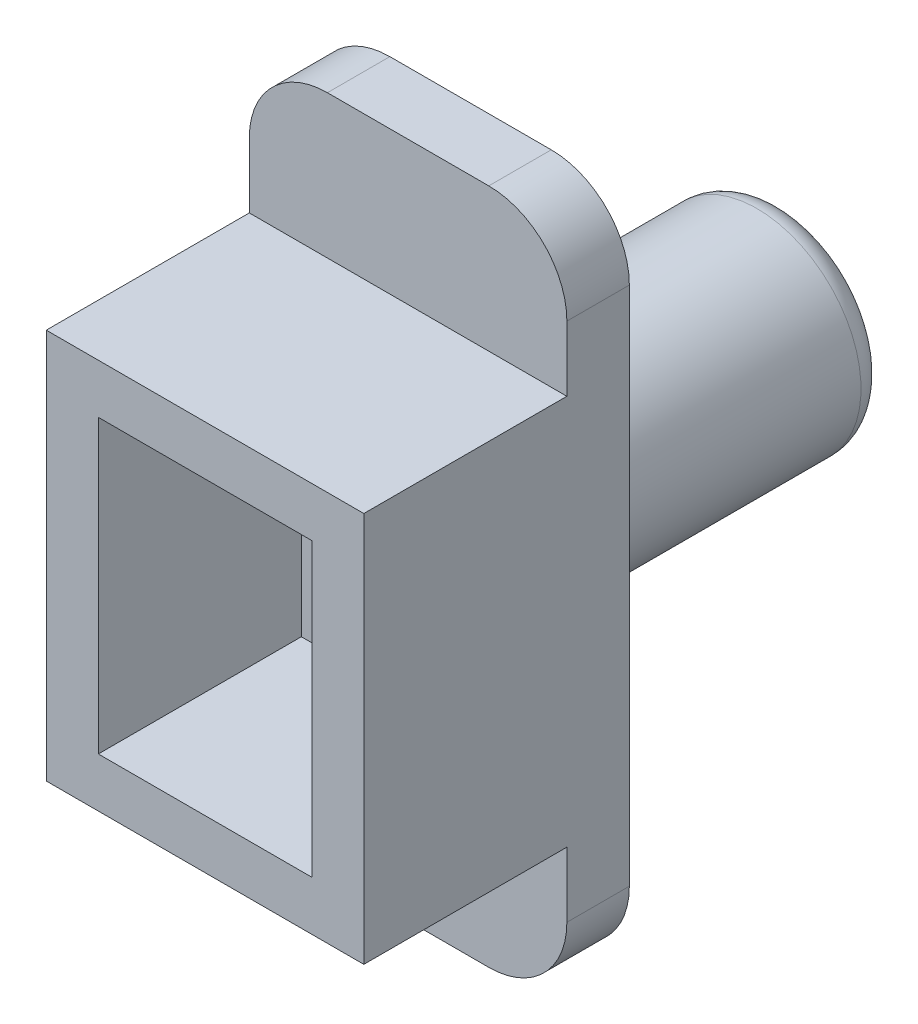
ISO-10303-21;
HEADER;
FILE_DESCRIPTION(('STEP AP214'),'2;1');
FILE_NAME('part.step','',(''),(''),'','','');
FILE_SCHEMA(('AUTOMOTIVE_DESIGN { 1 0 10303 214 1 1 1 1 }'));
ENDSEC;
DATA;
#1=APPLICATION_CONTEXT('core data for automotive mechanical design processes');
#2=APPLICATION_PROTOCOL_DEFINITION('international standard','automotive_design',2000,#1);
#3=PRODUCT_CONTEXT('',#1,'mechanical');
#4=PRODUCT('Part','Part','',(#3));
#5=PRODUCT_RELATED_PRODUCT_CATEGORY('part','',(#4));
#6=PRODUCT_DEFINITION_FORMATION('','',#4);
#7=PRODUCT_DEFINITION_CONTEXT('part definition',#1,'design');
#8=PRODUCT_DEFINITION('design','',#6,#7);
#9=PRODUCT_DEFINITION_SHAPE('','',#8);
#10=(LENGTH_UNIT() NAMED_UNIT(*) SI_UNIT(.MILLI.,.METRE.));
#11=(NAMED_UNIT(*) PLANE_ANGLE_UNIT() SI_UNIT($,.RADIAN.));
#12=(NAMED_UNIT(*) SI_UNIT($,.STERADIAN.) SOLID_ANGLE_UNIT());
#13=UNCERTAINTY_MEASURE_WITH_UNIT(LENGTH_MEASURE(1.E-05),#10,'distance_accuracy_value','');
#14=(GEOMETRIC_REPRESENTATION_CONTEXT(3) GLOBAL_UNCERTAINTY_ASSIGNED_CONTEXT((#13)) GLOBAL_UNIT_ASSIGNED_CONTEXT((#10,
#11,#12)) REPRESENTATION_CONTEXT('',''));
#15=CARTESIAN_POINT('',(0.,0.,0.));
#16=DIRECTION('',(0.,0.,1.));
#17=DIRECTION('',(1.,0.,0.));
#18=AXIS2_PLACEMENT_3D('',#15,#16,#17);
#19=CARTESIAN_POINT('',(0.,0.,-4.8));
#20=DIRECTION('',(0.,0.,1.));
#21=DIRECTION('',(1.,0.,0.));
#22=AXIS2_PLACEMENT_3D('',#19,#20,#21);
#23=PLANE('',#22);
#24=CARTESIAN_POINT('',(0.,0.,-4.8));
#25=DIRECTION('',(0.,0.,1.));
#26=DIRECTION('',(1.,0.,0.));
#27=AXIS2_PLACEMENT_3D('',#24,#25,#26);
#28=CIRCLE('',#27,0.75);
#29=CARTESIAN_POINT('',(0.75,0.,-4.8));
#30=VERTEX_POINT('',#29);
#31=EDGE_CURVE('E351',#30,#30,#28,.T.);
#32=ORIENTED_EDGE('',*,*,#31,.T.);
#33=EDGE_LOOP('',(#32));
#34=FACE_BOUND('',#33,.T.);
#35=ADVANCED_FACE('F17',(#34),#23,.T.);
#36=CARTESIAN_POINT('',(0.,0.,1.2));
#37=DIRECTION('',(0.,0.,1.));
#38=DIRECTION('',(1.,0.,0.));
#39=AXIS2_PLACEMENT_3D('',#36,#37,#38);
#40=CYLINDRICAL_SURFACE('',#39,0.75);
#41=ORIENTED_EDGE('',*,*,#31,.F.);
#42=EDGE_LOOP('',(#41));
#43=FACE_BOUND('',#42,.T.);
#44=CARTESIAN_POINT('',(0.,0.,1.2));
#45=DIRECTION('',(0.,0.,1.));
#46=DIRECTION('',(1.,0.,0.));
#47=AXIS2_PLACEMENT_3D('',#44,#45,#46);
#48=CIRCLE('',#47,0.75);
#49=CARTESIAN_POINT('',(0.75,0.,1.2));
#50=VERTEX_POINT('',#49);
#51=EDGE_CURVE('E347',#50,#50,#48,.T.);
#52=ORIENTED_EDGE('',*,*,#51,.T.);
#53=EDGE_LOOP('',(#52));
#54=FACE_BOUND('',#53,.T.);
#55=ADVANCED_FACE('F213',(#43,#54),#40,.F.);
#56=CARTESIAN_POINT('',(0.,0.,1.2));
#57=DIRECTION('',(0.,0.,-1.));
#58=DIRECTION('',(-1.,0.,0.));
#59=AXIS2_PLACEMENT_3D('',#56,#57,#58);
#60=PLANE('',#59);
#61=ORIENTED_EDGE('',*,*,#51,.F.);
#62=EDGE_LOOP('',(#61));
#63=FACE_BOUND('',#62,.T.);
#64=DIRECTION('',(0.,1.,0.));
#65=VECTOR('',#64,1.);
#66=CARTESIAN_POINT('',(-2.05,2.8,1.2));
#67=LINE('',#66,#65);
#68=CARTESIAN_POINT('',(-2.05,2.8,1.2));
#69=VERTEX_POINT('',#68);
#70=CARTESIAN_POINT('',(-2.05,-2.8,1.2));
#71=VERTEX_POINT('',#70);
#72=EDGE_CURVE('E440',#69,#71,#67,.F.);
#73=ORIENTED_EDGE('',*,*,#72,.T.);
#74=DIRECTION('',(1.,0.,0.));
#75=VECTOR('',#74,1.);
#76=CARTESIAN_POINT('',(-2.05,-2.8,1.2));
#77=LINE('',#76,#75);
#78=CARTESIAN_POINT('',(2.05,-2.8,1.2));
#79=VERTEX_POINT('',#78);
#80=EDGE_CURVE('E445',#71,#79,#77,.T.);
#81=ORIENTED_EDGE('',*,*,#80,.T.);
#82=DIRECTION('',(0.,1.,0.));
#83=VECTOR('',#82,1.);
#84=CARTESIAN_POINT('',(2.05,-2.8,1.2));
#85=LINE('',#84,#83);
#86=CARTESIAN_POINT('',(2.05,2.8,1.2));
#87=VERTEX_POINT('',#86);
#88=EDGE_CURVE('E355',#79,#87,#85,.T.);
#89=ORIENTED_EDGE('',*,*,#88,.T.);
#90=DIRECTION('',(1.,0.,0.));
#91=VECTOR('',#90,1.);
#92=CARTESIAN_POINT('',(2.05,2.8,1.2));
#93=LINE('',#92,#91);
#94=EDGE_CURVE('E350',#87,#69,#93,.F.);
#95=ORIENTED_EDGE('',*,*,#94,.T.);
#96=EDGE_LOOP('',(#73,#81,#89,#95));
#97=FACE_BOUND('',#96,.T.);
#98=ADVANCED_FACE('F210',(#63,#97),#60,.F.);
#99=CARTESIAN_POINT('',(2.05,2.8,5.1));
#100=DIRECTION('',(0.,1.,0.));
#101=DIRECTION('',(0.,0.,1.));
#102=AXIS2_PLACEMENT_3D('',#99,#100,#101);
#103=PLANE('',#102);
#104=DIRECTION('',(1.,0.,0.));
#105=VECTOR('',#104,1.);
#106=CARTESIAN_POINT('',(0.,2.8,5.1));
#107=LINE('',#106,#105);
#108=CARTESIAN_POINT('',(-2.05,2.8,5.1));
#109=VERTEX_POINT('',#108);
#110=CARTESIAN_POINT('',(2.05,2.8,5.1));
#111=VERTEX_POINT('',#110);
#112=EDGE_CURVE('E306',#109,#111,#107,.T.);
#113=ORIENTED_EDGE('',*,*,#112,.F.);
#114=DIRECTION('',(0.,0.,1.));
#115=VECTOR('',#114,1.);
#116=CARTESIAN_POINT('',(-2.05,2.8,5.1));
#117=LINE('',#116,#115);
#118=EDGE_CURVE('E313',#109,#69,#117,.F.);
#119=ORIENTED_EDGE('',*,*,#118,.T.);
#120=ORIENTED_EDGE('',*,*,#94,.F.);
#121=DIRECTION('',(0.,0.,-1.));
#122=VECTOR('',#121,1.);
#123=CARTESIAN_POINT('',(2.05,2.8,5.1));
#124=LINE('',#123,#122);
#125=EDGE_CURVE('E361',#87,#111,#124,.F.);
#126=ORIENTED_EDGE('',*,*,#125,.T.);
#127=EDGE_LOOP('',(#113,#119,#120,#126));
#128=FACE_BOUND('',#127,.T.);
#129=ADVANCED_FACE('F206',(#128),#103,.F.);
#130=CARTESIAN_POINT('',(2.05,-2.8,5.1));
#131=DIRECTION('',(1.,0.,0.));
#132=DIRECTION('',(0.,0.,-1.));
#133=AXIS2_PLACEMENT_3D('',#130,#131,#132);
#134=PLANE('',#133);
#135=DIRECTION('',(0.,1.,0.));
#136=VECTOR('',#135,1.);
#137=CARTESIAN_POINT('',(2.05,0.,5.1));
#138=LINE('',#137,#136);
#139=CARTESIAN_POINT('',(2.05,-2.8,5.1));
#140=VERTEX_POINT('',#139);
#141=EDGE_CURVE('E304',#111,#140,#138,.F.);
#142=ORIENTED_EDGE('',*,*,#141,.F.);
#143=ORIENTED_EDGE('',*,*,#125,.F.);
#144=ORIENTED_EDGE('',*,*,#88,.F.);
#145=DIRECTION('',(0.,0.,-1.));
#146=VECTOR('',#145,1.);
#147=CARTESIAN_POINT('',(2.05,-2.8,5.1));
#148=LINE('',#147,#146);
#149=EDGE_CURVE('E442',#79,#140,#148,.F.);
#150=ORIENTED_EDGE('',*,*,#149,.T.);
#151=EDGE_LOOP('',(#142,#143,#144,#150));
#152=FACE_BOUND('',#151,.T.);
#153=ADVANCED_FACE('F202',(#152),#134,.F.);
#154=CARTESIAN_POINT('',(-2.05,-2.8,5.1));
#155=DIRECTION('',(0.,-1.,0.));
#156=DIRECTION('',(0.,0.,-1.));
#157=AXIS2_PLACEMENT_3D('',#154,#155,#156);
#158=PLANE('',#157);
#159=DIRECTION('',(1.,0.,0.));
#160=VECTOR('',#159,1.);
#161=CARTESIAN_POINT('',(0.,-2.8,5.1));
#162=LINE('',#161,#160);
#163=CARTESIAN_POINT('',(-2.05,-2.8,5.1));
#164=VERTEX_POINT('',#163);
#165=EDGE_CURVE('E302',#140,#164,#162,.F.);
#166=ORIENTED_EDGE('',*,*,#165,.F.);
#167=ORIENTED_EDGE('',*,*,#149,.F.);
#168=ORIENTED_EDGE('',*,*,#80,.F.);
#169=DIRECTION('',(0.,0.,1.));
#170=VECTOR('',#169,1.);
#171=CARTESIAN_POINT('',(-2.05,-2.8,5.1));
#172=LINE('',#171,#170);
#173=EDGE_CURVE('E437',#71,#164,#172,.T.);
#174=ORIENTED_EDGE('',*,*,#173,.T.);
#175=EDGE_LOOP('',(#166,#167,#168,#174));
#176=FACE_BOUND('',#175,.T.);
#177=ADVANCED_FACE('F198',(#176),#158,.F.);
#178=CARTESIAN_POINT('',(-2.05,2.8,5.1));
#179=DIRECTION('',(-1.,0.,0.));
#180=DIRECTION('',(0.,0.,1.));
#181=AXIS2_PLACEMENT_3D('',#178,#179,#180);
#182=PLANE('',#181);
#183=DIRECTION('',(0.,1.,0.));
#184=VECTOR('',#183,1.);
#185=CARTESIAN_POINT('',(-2.05,0.,5.1));
#186=LINE('',#185,#184);
#187=EDGE_CURVE('E299',#164,#109,#186,.T.);
#188=ORIENTED_EDGE('',*,*,#187,.F.);
#189=ORIENTED_EDGE('',*,*,#173,.F.);
#190=ORIENTED_EDGE('',*,*,#72,.F.);
#191=ORIENTED_EDGE('',*,*,#118,.F.);
#192=EDGE_LOOP('',(#188,#189,#190,#191));
#193=FACE_BOUND('',#192,.T.);
#194=ADVANCED_FACE('F193',(#193),#182,.F.);
#195=CARTESIAN_POINT('',(0.,0.,-6.));
#196=DIRECTION('',(0.,0.,-1.));
#197=DIRECTION('',(-1.,0.,0.));
#198=AXIS2_PLACEMENT_3D('',#195,#196,#197);
#199=PLANE('',#198);
#200=DIRECTION('',(-0.00697686083401635,0.999975661410268,0.));
#201=VECTOR('',#200,1.);
#202=CARTESIAN_POINT('',(1.499999949272,0.,-6.));
#203=LINE('',#202,#201);
#204=CARTESIAN_POINT('',(1.499999863604,0.,-5.99999999999995));
#205=VERTEX_POINT('',#204);
#206=CARTESIAN_POINT('',(1.49985369664931,0.0209300692633115,-5.99999999999994));
#207=VERTEX_POINT('',#206);
#208=EDGE_CURVE('E173',#205,#207,#203,.T.);
#209=ORIENTED_EDGE('',*,*,#208,.F.);
#210=CARTESIAN_POINT('',(0.,0.,-5.99999999999975));
#211=DIRECTION('',(0.,0.,1.));
#212=DIRECTION('',(-0.999902646823717,-0.0139533822038046,0.));
#213=AXIS2_PLACEMENT_3D('',#210,#211,#212);
#214=CIRCLE('',#213,1.49999949556802);
#215=CARTESIAN_POINT('',(-1.49985369268261,-0.020930069432528,-5.99999999999994));
#216=VERTEX_POINT('',#215);
#217=EDGE_CURVE('E164',#216,#205,#214,.T.);
#218=ORIENTED_EDGE('',*,*,#217,.F.);
#219=DIRECTION('',(0.0069768609088604,-0.999975661409746,0.));
#220=VECTOR('',#219,1.);
#221=CARTESIAN_POINT('',(-1.499999949272,0.,-6.));
#222=LINE('',#221,#220);
#223=CARTESIAN_POINT('',(-1.49999982061198,0.,-5.99999999999994));
#224=VERTEX_POINT('',#223);
#225=EDGE_CURVE('E160',#224,#216,#222,.T.);
#226=ORIENTED_EDGE('',*,*,#225,.F.);
#227=CARTESIAN_POINT('',(0.,0.,-5.99999999999975));
#228=DIRECTION('',(0.,0.,1.));
#229=DIRECTION('',(0.999902646825806,0.013953382054121,0.));
#230=AXIS2_PLACEMENT_3D('',#227,#228,#229);
#231=CIRCLE('',#230,1.49999950349592);
#232=EDGE_CURVE('E167',#207,#224,#231,.T.);
#233=ORIENTED_EDGE('',*,*,#232,.F.);
#234=EDGE_LOOP('',(#209,#218,#226,#233));
#235=FACE_BOUND('',#234,.T.);
#236=ADVANCED_FACE('F172',(#235),#199,.T.);
#237=CARTESIAN_POINT('',(0.,0.,1.2));
#238=DIRECTION('',(0.,0.,-1.));
#239=DIRECTION('',(-1.,0.,0.));
#240=AXIS2_PLACEMENT_3D('',#237,#238,#239);
#241=PLANE('',#240);
#242=DIRECTION('',(1.,0.,0.));
#243=VECTOR('',#242,1.);
#244=CARTESIAN_POINT('',(3.05,3.75,1.2));
#245=LINE('',#244,#243);
#246=CARTESIAN_POINT('',(3.05,3.75,1.2));
#247=VERTEX_POINT('',#246);
#248=CARTESIAN_POINT('',(-3.05,3.75,1.2));
#249=VERTEX_POINT('',#248);
#250=EDGE_CURVE('E289',#247,#249,#245,.F.);
#251=ORIENTED_EDGE('',*,*,#250,.F.);
#252=DIRECTION('',(0.,1.,0.));
#253=VECTOR('',#252,1.);
#254=CARTESIAN_POINT('',(3.05,-3.75,1.2));
#255=LINE('',#254,#253);
#256=CARTESIAN_POINT('',(3.05,5.,1.2));
#257=VERTEX_POINT('',#256);
#258=EDGE_CURVE('E316',#257,#247,#255,.F.);
#259=ORIENTED_EDGE('',*,*,#258,.F.);
#260=CARTESIAN_POINT('',(1.55,5.,1.2));
#261=DIRECTION('',(0.,0.,1.));
#262=DIRECTION('',(1.,0.,0.));
#263=AXIS2_PLACEMENT_3D('',#260,#261,#262);
#264=CIRCLE('',#263,1.5);
#265=CARTESIAN_POINT('',(1.55,6.5,1.2));
#266=VERTEX_POINT('',#265);
#267=EDGE_CURVE('E336',#266,#257,#264,.F.);
#268=ORIENTED_EDGE('',*,*,#267,.F.);
#269=DIRECTION('',(1.,0.,0.));
#270=VECTOR('',#269,1.);
#271=CARTESIAN_POINT('',(-3.05,6.5,1.2));
#272=LINE('',#271,#270);
#273=CARTESIAN_POINT('',(-1.55,6.5,1.2));
#274=VERTEX_POINT('',#273);
#275=EDGE_CURVE('E308',#274,#266,#272,.T.);
#276=ORIENTED_EDGE('',*,*,#275,.F.);
#277=CARTESIAN_POINT('',(-1.55,5.,1.2));
#278=DIRECTION('',(0.,0.,1.));
#279=DIRECTION('',(1.,0.,0.));
#280=AXIS2_PLACEMENT_3D('',#277,#278,#279);
#281=CIRCLE('',#280,1.5);
#282=CARTESIAN_POINT('',(-3.05,5.,1.2));
#283=VERTEX_POINT('',#282);
#284=EDGE_CURVE('E381',#283,#274,#281,.F.);
#285=ORIENTED_EDGE('',*,*,#284,.F.);
#286=DIRECTION('',(0.,1.,0.));
#287=VECTOR('',#286,1.);
#288=CARTESIAN_POINT('',(-3.05,0.,1.2));
#289=LINE('',#288,#287);
#290=EDGE_CURVE('E124',#249,#283,#289,.T.);
#291=ORIENTED_EDGE('',*,*,#290,.F.);
#292=EDGE_LOOP('',(#251,#259,#268,#276,#285,#291));
#293=FACE_BOUND('',#292,.T.);
#294=ADVANCED_FACE('F192',(#293),#241,.F.);
#295=CARTESIAN_POINT('',(0.,0.,5.1));
#296=DIRECTION('',(0.,0.,1.));
#297=DIRECTION('',(1.,0.,0.));
#298=AXIS2_PLACEMENT_3D('',#295,#296,#297);
#299=PLANE('',#298);
#300=ORIENTED_EDGE('',*,*,#165,.T.);
#301=ORIENTED_EDGE('',*,*,#187,.T.);
#302=ORIENTED_EDGE('',*,*,#112,.T.);
#303=ORIENTED_EDGE('',*,*,#141,.T.);
#304=EDGE_LOOP('',(#300,#301,#302,#303));
#305=FACE_BOUND('',#304,.T.);
#306=DIRECTION('',(1.,0.,0.));
#307=VECTOR('',#306,1.);
#308=CARTESIAN_POINT('',(3.05,3.75,5.1));
#309=LINE('',#308,#307);
#310=CARTESIAN_POINT('',(-3.05,3.75,5.1));
#311=VERTEX_POINT('',#310);
#312=CARTESIAN_POINT('',(3.05,3.75,5.1));
#313=VERTEX_POINT('',#312);
#314=EDGE_CURVE('E297',#311,#313,#309,.T.);
#315=ORIENTED_EDGE('',*,*,#314,.F.);
#316=DIRECTION('',(0.,1.,0.));
#317=VECTOR('',#316,1.);
#318=CARTESIAN_POINT('',(-3.05,3.75,5.1));
#319=LINE('',#318,#317);
#320=CARTESIAN_POINT('',(-3.05,-3.75,5.1));
#321=VERTEX_POINT('',#320);
#322=EDGE_CURVE('E132',#321,#311,#319,.T.);
#323=ORIENTED_EDGE('',*,*,#322,.F.);
#324=DIRECTION('',(1.,0.,0.));
#325=VECTOR('',#324,1.);
#326=CARTESIAN_POINT('',(-3.05,-3.75,5.1));
#327=LINE('',#326,#325);
#328=CARTESIAN_POINT('',(3.05,-3.75,5.1));
#329=VERTEX_POINT('',#328);
#330=EDGE_CURVE('E287',#329,#321,#327,.F.);
#331=ORIENTED_EDGE('',*,*,#330,.F.);
#332=DIRECTION('',(0.,1.,0.));
#333=VECTOR('',#332,1.);
#334=CARTESIAN_POINT('',(3.05,-3.75,5.1));
#335=LINE('',#334,#333);
#336=EDGE_CURVE('E327',#313,#329,#335,.F.);
#337=ORIENTED_EDGE('',*,*,#336,.F.);
#338=EDGE_LOOP('',(#315,#323,#331,#337));
#339=FACE_BOUND('',#338,.T.);
#340=ADVANCED_FACE('F423',(#305,#339),#299,.T.);
#341=CARTESIAN_POINT('',(3.05,3.75,0.));
#342=DIRECTION('',(0.,1.,0.));
#343=DIRECTION('',(0.,0.,1.));
#344=AXIS2_PLACEMENT_3D('',#341,#342,#343);
#345=PLANE('',#344);
#346=DIRECTION('',(0.,0.,-1.));
#347=VECTOR('',#346,1.);
#348=CARTESIAN_POINT('',(3.05,3.75,0.));
#349=LINE('',#348,#347);
#350=EDGE_CURVE('E318',#247,#313,#349,.F.);
#351=ORIENTED_EDGE('',*,*,#350,.F.);
#352=ORIENTED_EDGE('',*,*,#250,.T.);
#353=DIRECTION('',(0.,0.,1.));
#354=VECTOR('',#353,1.);
#355=CARTESIAN_POINT('',(-3.05,3.75,0.));
#356=LINE('',#355,#354);
#357=EDGE_CURVE('E412',#311,#249,#356,.F.);
#358=ORIENTED_EDGE('',*,*,#357,.F.);
#359=ORIENTED_EDGE('',*,*,#314,.T.);
#360=EDGE_LOOP('',(#351,#352,#358,#359));
#361=FACE_BOUND('',#360,.T.);
#362=ADVANCED_FACE('F457',(#361),#345,.T.);
#363=CARTESIAN_POINT('',(-3.05,-3.75,0.));
#364=DIRECTION('',(0.,-1.,0.));
#365=DIRECTION('',(0.,0.,-1.));
#366=AXIS2_PLACEMENT_3D('',#363,#364,#365);
#367=PLANE('',#366);
#368=DIRECTION('',(0.,0.,1.));
#369=VECTOR('',#368,1.);
#370=CARTESIAN_POINT('',(-3.05,-3.75,0.));
#371=LINE('',#370,#369);
#372=CARTESIAN_POINT('',(-3.05,-3.75,1.2));
#373=VERTEX_POINT('',#372);
#374=EDGE_CURVE('E283',#373,#321,#371,.T.);
#375=ORIENTED_EDGE('',*,*,#374,.F.);
#376=DIRECTION('',(-1.,0.,0.));
#377=VECTOR('',#376,1.);
#378=CARTESIAN_POINT('',(0.,-3.75,1.2));
#379=LINE('',#378,#377);
#380=CARTESIAN_POINT('',(3.05,-3.75,1.2));
#381=VERTEX_POINT('',#380);
#382=EDGE_CURVE('E100',#373,#381,#379,.F.);
#383=ORIENTED_EDGE('',*,*,#382,.T.);
#384=DIRECTION('',(0.,0.,-1.));
#385=VECTOR('',#384,1.);
#386=CARTESIAN_POINT('',(3.05,-3.75,0.));
#387=LINE('',#386,#385);
#388=EDGE_CURVE('E334',#329,#381,#387,.T.);
#389=ORIENTED_EDGE('',*,*,#388,.F.);
#390=ORIENTED_EDGE('',*,*,#330,.T.);
#391=EDGE_LOOP('',(#375,#383,#389,#390));
#392=FACE_BOUND('',#391,.T.);
#393=ADVANCED_FACE('F425',(#392),#367,.T.);
#394=CARTESIAN_POINT('',(0.,0.,1.2));
#395=DIRECTION('',(0.,0.,-1.));
#396=DIRECTION('',(-1.,0.,0.));
#397=AXIS2_PLACEMENT_3D('',#394,#395,#396);
#398=PLANE('',#397);
#399=CARTESIAN_POINT('',(-1.55,-5.,1.2));
#400=DIRECTION('',(0.,0.,1.));
#401=DIRECTION('',(1.,0.,0.));
#402=AXIS2_PLACEMENT_3D('',#399,#400,#401);
#403=CIRCLE('',#402,1.5);
#404=CARTESIAN_POINT('',(-1.55,-6.5,1.2));
#405=VERTEX_POINT('',#404);
#406=CARTESIAN_POINT('',(-3.05,-5.,1.2));
#407=VERTEX_POINT('',#406);
#408=EDGE_CURVE('E294',#405,#407,#403,.F.);
#409=ORIENTED_EDGE('',*,*,#408,.F.);
#410=DIRECTION('',(1.,0.,0.));
#411=VECTOR('',#410,1.);
#412=CARTESIAN_POINT('',(3.05,-6.5,1.2));
#413=LINE('',#412,#411);
#414=CARTESIAN_POINT('',(1.55,-6.5,1.2));
#415=VERTEX_POINT('',#414);
#416=EDGE_CURVE('E277',#415,#405,#413,.F.);
#417=ORIENTED_EDGE('',*,*,#416,.F.);
#418=CARTESIAN_POINT('',(1.55,-5.,1.2));
#419=DIRECTION('',(0.,0.,1.));
#420=DIRECTION('',(1.,0.,0.));
#421=AXIS2_PLACEMENT_3D('',#418,#419,#420);
#422=CIRCLE('',#421,1.5);
#423=CARTESIAN_POINT('',(3.05,-5.,1.2));
#424=VERTEX_POINT('',#423);
#425=EDGE_CURVE('E331',#424,#415,#422,.F.);
#426=ORIENTED_EDGE('',*,*,#425,.F.);
#427=DIRECTION('',(0.,1.,0.));
#428=VECTOR('',#427,1.);
#429=CARTESIAN_POINT('',(3.05,-3.75,1.2));
#430=LINE('',#429,#428);
#431=EDGE_CURVE('E88',#381,#424,#430,.F.);
#432=ORIENTED_EDGE('',*,*,#431,.F.);
#433=ORIENTED_EDGE('',*,*,#382,.F.);
#434=DIRECTION('',(0.,1.,0.));
#435=VECTOR('',#434,1.);
#436=CARTESIAN_POINT('',(-3.05,3.75,1.2));
#437=LINE('',#436,#435);
#438=EDGE_CURVE('E280',#407,#373,#437,.T.);
#439=ORIENTED_EDGE('',*,*,#438,.F.);
#440=EDGE_LOOP('',(#409,#417,#426,#432,#433,#439));
#441=FACE_BOUND('',#440,.T.);
#442=ADVANCED_FACE('F269',(#441),#398,.F.);
#443=CARTESIAN_POINT('',(0.,0.,-5.5));
#444=DIRECTION('',(0.,0.,-1.));
#445=DIRECTION('',(-1.,0.,0.));
#446=AXIS2_PLACEMENT_3D('',#443,#444,#445);
#447=TOROIDAL_SURFACE('',#446,1.5,0.5);
#448=ORIENTED_EDGE('',*,*,#217,.T.);
#449=ORIENTED_EDGE('',*,*,#208,.T.);
#450=ORIENTED_EDGE('',*,*,#232,.T.);
#451=ORIENTED_EDGE('',*,*,#225,.T.);
#452=EDGE_LOOP('',(#448,#449,#450,#451));
#453=FACE_BOUND('',#452,.T.);
#454=CARTESIAN_POINT('',(0.,0.,-5.5));
#455=DIRECTION('',(0.,0.,-1.));
#456=DIRECTION('',(-1.,0.,0.));
#457=AXIS2_PLACEMENT_3D('',#454,#455,#456);
#458=CIRCLE('',#457,2.);
#459=CARTESIAN_POINT('',(-2.,0.,-5.5));
#460=VERTEX_POINT('',#459);
#461=EDGE_CURVE('E275',#460,#460,#458,.F.);
#462=ORIENTED_EDGE('',*,*,#461,.F.);
#463=EDGE_LOOP('',(#462));
#464=FACE_BOUND('',#463,.T.);
#465=ADVANCED_FACE('F162',(#453,#464),#447,.T.);
#466=CARTESIAN_POINT('',(1.55,-5.,-0.02426621322982));
#467=DIRECTION('',(0.,0.,1.));
#468=DIRECTION('',(1.,0.,0.));
#469=AXIS2_PLACEMENT_3D('',#466,#467,#468);
#470=CYLINDRICAL_SURFACE('',#469,1.5);
#471=CARTESIAN_POINT('',(1.55,-5.,0.));
#472=DIRECTION('',(0.,0.,1.));
#473=DIRECTION('',(1.,0.,0.));
#474=AXIS2_PLACEMENT_3D('',#471,#472,#473);
#475=CIRCLE('',#474,1.5);
#476=CARTESIAN_POINT('',(1.55,-6.5,0.));
#477=VERTEX_POINT('',#476);
#478=CARTESIAN_POINT('',(3.05,-5.,0.));
#479=VERTEX_POINT('',#478);
#480=EDGE_CURVE('E377',#477,#479,#475,.T.);
#481=ORIENTED_EDGE('',*,*,#480,.T.);
#482=DIRECTION('',(0.,0.,-1.));
#483=VECTOR('',#482,1.);
#484=CARTESIAN_POINT('',(3.05,-5.,0.));
#485=LINE('',#484,#483);
#486=EDGE_CURVE('E319',#424,#479,#485,.T.);
#487=ORIENTED_EDGE('',*,*,#486,.F.);
#488=ORIENTED_EDGE('',*,*,#425,.T.);
#489=DIRECTION('',(0.,0.,-1.));
#490=VECTOR('',#489,1.);
#491=CARTESIAN_POINT('',(1.55,-6.5,0.));
#492=LINE('',#491,#490);
#493=EDGE_CURVE('E400',#477,#415,#492,.F.);
#494=ORIENTED_EDGE('',*,*,#493,.F.);
#495=EDGE_LOOP('',(#481,#487,#488,#494));
#496=FACE_BOUND('',#495,.T.);
#497=ADVANCED_FACE('F262',(#496),#470,.T.);
#498=CARTESIAN_POINT('',(3.05,-3.75,0.));
#499=DIRECTION('',(1.,0.,0.));
#500=DIRECTION('',(0.,0.,-1.));
#501=AXIS2_PLACEMENT_3D('',#498,#499,#500);
#502=PLANE('',#501);
#503=ORIENTED_EDGE('',*,*,#336,.T.);
#504=ORIENTED_EDGE('',*,*,#388,.T.);
#505=ORIENTED_EDGE('',*,*,#431,.T.);
#506=ORIENTED_EDGE('',*,*,#486,.T.);
#507=DIRECTION('',(0.,1.,0.));
#508=VECTOR('',#507,1.);
#509=CARTESIAN_POINT('',(3.05,0.,0.));
#510=LINE('',#509,#508);
#511=CARTESIAN_POINT('',(3.05,5.,0.));
#512=VERTEX_POINT('',#511);
#513=EDGE_CURVE('E376',#479,#512,#510,.T.);
#514=ORIENTED_EDGE('',*,*,#513,.T.);
#515=DIRECTION('',(0.,0.,1.));
#516=VECTOR('',#515,1.);
#517=CARTESIAN_POINT('',(3.05,5.,-0.02736972730741));
#518=LINE('',#517,#516);
#519=EDGE_CURVE('E311',#257,#512,#518,.F.);
#520=ORIENTED_EDGE('',*,*,#519,.F.);
#521=ORIENTED_EDGE('',*,*,#258,.T.);
#522=ORIENTED_EDGE('',*,*,#350,.T.);
#523=EDGE_LOOP('',(#503,#504,#505,#506,#514,#520,#521,#522));
#524=FACE_BOUND('',#523,.T.);
#525=ADVANCED_FACE('F258',(#524),#502,.T.);
#526=CARTESIAN_POINT('',(1.55,5.,-0.02736972730741));
#527=DIRECTION('',(0.,0.,1.));
#528=DIRECTION('',(1.,0.,0.));
#529=AXIS2_PLACEMENT_3D('',#526,#527,#528);
#530=CYLINDRICAL_SURFACE('',#529,1.5);
#531=CARTESIAN_POINT('',(1.55,5.,0.));
#532=DIRECTION('',(0.,0.,1.));
#533=DIRECTION('',(1.,0.,0.));
#534=AXIS2_PLACEMENT_3D('',#531,#532,#533);
#535=CIRCLE('',#534,1.5);
#536=CARTESIAN_POINT('',(1.55,6.5,0.));
#537=VERTEX_POINT('',#536);
#538=EDGE_CURVE('E373',#512,#537,#535,.T.);
#539=ORIENTED_EDGE('',*,*,#538,.T.);
#540=DIRECTION('',(0.,0.,1.));
#541=VECTOR('',#540,1.);
#542=CARTESIAN_POINT('',(1.55,6.5,0.));
#543=LINE('',#542,#541);
#544=EDGE_CURVE('E310',#266,#537,#543,.F.);
#545=ORIENTED_EDGE('',*,*,#544,.F.);
#546=ORIENTED_EDGE('',*,*,#267,.T.);
#547=ORIENTED_EDGE('',*,*,#519,.T.);
#548=EDGE_LOOP('',(#539,#545,#546,#547));
#549=FACE_BOUND('',#548,.T.);
#550=ADVANCED_FACE('F254',(#549),#530,.T.);
#551=CARTESIAN_POINT('',(-3.05,6.5,0.));
#552=DIRECTION('',(0.,1.,0.));
#553=DIRECTION('',(0.,0.,1.));
#554=AXIS2_PLACEMENT_3D('',#551,#552,#553);
#555=PLANE('',#554);
#556=ORIENTED_EDGE('',*,*,#275,.T.);
#557=ORIENTED_EDGE('',*,*,#544,.T.);
#558=DIRECTION('',(1.,0.,0.));
#559=VECTOR('',#558,1.);
#560=CARTESIAN_POINT('',(0.,6.5,0.));
#561=LINE('',#560,#559);
#562=CARTESIAN_POINT('',(-1.55,6.5,0.));
#563=VERTEX_POINT('',#562);
#564=EDGE_CURVE('E372',#537,#563,#561,.F.);
#565=ORIENTED_EDGE('',*,*,#564,.T.);
#566=DIRECTION('',(0.,0.,1.));
#567=VECTOR('',#566,1.);
#568=CARTESIAN_POINT('',(-1.55,6.5,-0.02426621322982));
#569=LINE('',#568,#567);
#570=EDGE_CURVE('E382',#274,#563,#569,.F.);
#571=ORIENTED_EDGE('',*,*,#570,.F.);
#572=EDGE_LOOP('',(#556,#557,#565,#571));
#573=FACE_BOUND('',#572,.T.);
#574=ADVANCED_FACE('F250',(#573),#555,.T.);
#575=CARTESIAN_POINT('',(-1.55,5.,-0.02426621322982));
#576=DIRECTION('',(0.,0.,1.));
#577=DIRECTION('',(1.,0.,0.));
#578=AXIS2_PLACEMENT_3D('',#575,#576,#577);
#579=CYLINDRICAL_SURFACE('',#578,1.5);
#580=CARTESIAN_POINT('',(-1.55,5.,0.));
#581=DIRECTION('',(0.,0.,1.));
#582=DIRECTION('',(1.,0.,0.));
#583=AXIS2_PLACEMENT_3D('',#580,#581,#582);
#584=CIRCLE('',#583,1.5);
#585=CARTESIAN_POINT('',(-3.05,5.,0.));
#586=VERTEX_POINT('',#585);
#587=EDGE_CURVE('E369',#563,#586,#584,.T.);
#588=ORIENTED_EDGE('',*,*,#587,.T.);
#589=DIRECTION('',(0.,0.,1.));
#590=VECTOR('',#589,1.);
#591=CARTESIAN_POINT('',(-3.05,5.,0.));
#592=LINE('',#591,#590);
#593=EDGE_CURVE('E284',#283,#586,#592,.F.);
#594=ORIENTED_EDGE('',*,*,#593,.F.);
#595=ORIENTED_EDGE('',*,*,#284,.T.);
#596=ORIENTED_EDGE('',*,*,#570,.T.);
#597=EDGE_LOOP('',(#588,#594,#595,#596));
#598=FACE_BOUND('',#597,.T.);
#599=ADVANCED_FACE('F247',(#598),#579,.T.);
#600=CARTESIAN_POINT('',(-3.05,3.75,0.));
#601=DIRECTION('',(-1.,0.,0.));
#602=DIRECTION('',(0.,0.,1.));
#603=AXIS2_PLACEMENT_3D('',#600,#601,#602);
#604=PLANE('',#603);
#605=ORIENTED_EDGE('',*,*,#438,.T.);
#606=ORIENTED_EDGE('',*,*,#374,.T.);
#607=ORIENTED_EDGE('',*,*,#322,.T.);
#608=ORIENTED_EDGE('',*,*,#357,.T.);
#609=ORIENTED_EDGE('',*,*,#290,.T.);
#610=ORIENTED_EDGE('',*,*,#593,.T.);
#611=DIRECTION('',(0.,1.,0.));
#612=VECTOR('',#611,1.);
#613=CARTESIAN_POINT('',(-3.05,0.,0.));
#614=LINE('',#613,#612);
#615=CARTESIAN_POINT('',(-3.05,-5.,0.));
#616=VERTEX_POINT('',#615);
#617=EDGE_CURVE('E368',#586,#616,#614,.F.);
#618=ORIENTED_EDGE('',*,*,#617,.T.);
#619=DIRECTION('',(0.,0.,1.));
#620=VECTOR('',#619,1.);
#621=CARTESIAN_POINT('',(-3.05,-5.,-0.02736972730741));
#622=LINE('',#621,#620);
#623=EDGE_CURVE('E279',#407,#616,#622,.F.);
#624=ORIENTED_EDGE('',*,*,#623,.F.);
#625=EDGE_LOOP('',(#605,#606,#607,#608,#609,#610,#618,#624));
#626=FACE_BOUND('',#625,.T.);
#627=ADVANCED_FACE('F243',(#626),#604,.T.);
#628=CARTESIAN_POINT('',(-1.55,-5.,-0.02736972730741));
#629=DIRECTION('',(0.,0.,1.));
#630=DIRECTION('',(1.,0.,0.));
#631=AXIS2_PLACEMENT_3D('',#628,#629,#630);
#632=CYLINDRICAL_SURFACE('',#631,1.5);
#633=CARTESIAN_POINT('',(-1.55,-5.,0.));
#634=DIRECTION('',(0.,0.,1.));
#635=DIRECTION('',(1.,0.,0.));
#636=AXIS2_PLACEMENT_3D('',#633,#634,#635);
#637=CIRCLE('',#636,1.5);
#638=CARTESIAN_POINT('',(-1.55,-6.5,0.));
#639=VERTEX_POINT('',#638);
#640=EDGE_CURVE('E365',#616,#639,#637,.T.);
#641=ORIENTED_EDGE('',*,*,#640,.T.);
#642=DIRECTION('',(0.,0.,-1.));
#643=VECTOR('',#642,1.);
#644=CARTESIAN_POINT('',(-1.55,-6.5,0.));
#645=LINE('',#644,#643);
#646=EDGE_CURVE('E37',#405,#639,#645,.T.);
#647=ORIENTED_EDGE('',*,*,#646,.F.);
#648=ORIENTED_EDGE('',*,*,#408,.T.);
#649=ORIENTED_EDGE('',*,*,#623,.T.);
#650=EDGE_LOOP('',(#641,#647,#648,#649));
#651=FACE_BOUND('',#650,.T.);
#652=ADVANCED_FACE('F240',(#651),#632,.T.);
#653=CARTESIAN_POINT('',(3.05,-6.5,0.));
#654=DIRECTION('',(0.,-1.,0.));
#655=DIRECTION('',(0.,0.,-1.));
#656=AXIS2_PLACEMENT_3D('',#653,#654,#655);
#657=PLANE('',#656);
#658=DIRECTION('',(1.,0.,0.));
#659=VECTOR('',#658,1.);
#660=CARTESIAN_POINT('',(0.,-6.5,0.));
#661=LINE('',#660,#659);
#662=EDGE_CURVE('E28',#639,#477,#661,.T.);
#663=ORIENTED_EDGE('',*,*,#662,.T.);
#664=ORIENTED_EDGE('',*,*,#493,.T.);
#665=ORIENTED_EDGE('',*,*,#416,.T.);
#666=ORIENTED_EDGE('',*,*,#646,.T.);
#667=EDGE_LOOP('',(#663,#664,#665,#666));
#668=FACE_BOUND('',#667,.T.);
#669=ADVANCED_FACE('F232',(#668),#657,.T.);
#670=CARTESIAN_POINT('',(0.,0.,0.));
#671=DIRECTION('',(0.,0.,-1.));
#672=DIRECTION('',(-1.,0.,0.));
#673=AXIS2_PLACEMENT_3D('',#670,#671,#672);
#674=CYLINDRICAL_SURFACE('',#673,2.);
#675=ORIENTED_EDGE('',*,*,#461,.T.);
#676=EDGE_LOOP('',(#675));
#677=FACE_BOUND('',#676,.T.);
#678=CARTESIAN_POINT('',(0.,0.,0.));
#679=DIRECTION('',(0.,0.,-1.));
#680=DIRECTION('',(-1.,0.,0.));
#681=AXIS2_PLACEMENT_3D('',#678,#679,#680);
#682=CIRCLE('',#681,2.);
#683=CARTESIAN_POINT('',(-2.,0.,0.));
#684=VERTEX_POINT('',#683);
#685=EDGE_CURVE('E11',#684,#684,#682,.T.);
#686=ORIENTED_EDGE('',*,*,#685,.T.);
#687=EDGE_LOOP('',(#686));
#688=FACE_BOUND('',#687,.T.);
#689=ADVANCED_FACE('F226',(#677,#688),#674,.T.);
#690=CARTESIAN_POINT('',(0.,0.,0.));
#691=DIRECTION('',(0.,0.,1.));
#692=DIRECTION('',(1.,0.,0.));
#693=AXIS2_PLACEMENT_3D('',#690,#691,#692);
#694=PLANE('',#693);
#695=ORIENTED_EDGE('',*,*,#685,.F.);
#696=EDGE_LOOP('',(#695));
#697=FACE_BOUND('',#696,.T.);
#698=ORIENTED_EDGE('',*,*,#640,.F.);
#699=ORIENTED_EDGE('',*,*,#617,.F.);
#700=ORIENTED_EDGE('',*,*,#587,.F.);
#701=ORIENTED_EDGE('',*,*,#564,.F.);
#702=ORIENTED_EDGE('',*,*,#538,.F.);
#703=ORIENTED_EDGE('',*,*,#513,.F.);
#704=ORIENTED_EDGE('',*,*,#480,.F.);
#705=ORIENTED_EDGE('',*,*,#662,.F.);
#706=EDGE_LOOP('',(#698,#699,#700,#701,#702,#703,#704,#705));
#707=FACE_BOUND('',#706,.T.);
#708=ADVANCED_FACE('F224',(#697,#707),#694,.F.);
#709=CLOSED_SHELL('',(#35,#55,#98,#129,#153,#177,#194,#236,#294,#340,#362,#393,#442,#465,#497,
#525,#550,#574,#599,#627,#652,#669,#689,#708));
#710=MANIFOLD_SOLID_BREP('B1',#709);
#711=ADVANCED_BREP_SHAPE_REPRESENTATION('',(#18,#710),#14);
#712=SHAPE_DEFINITION_REPRESENTATION(#9,#711);
ENDSEC;
END-ISO-10303-21;
